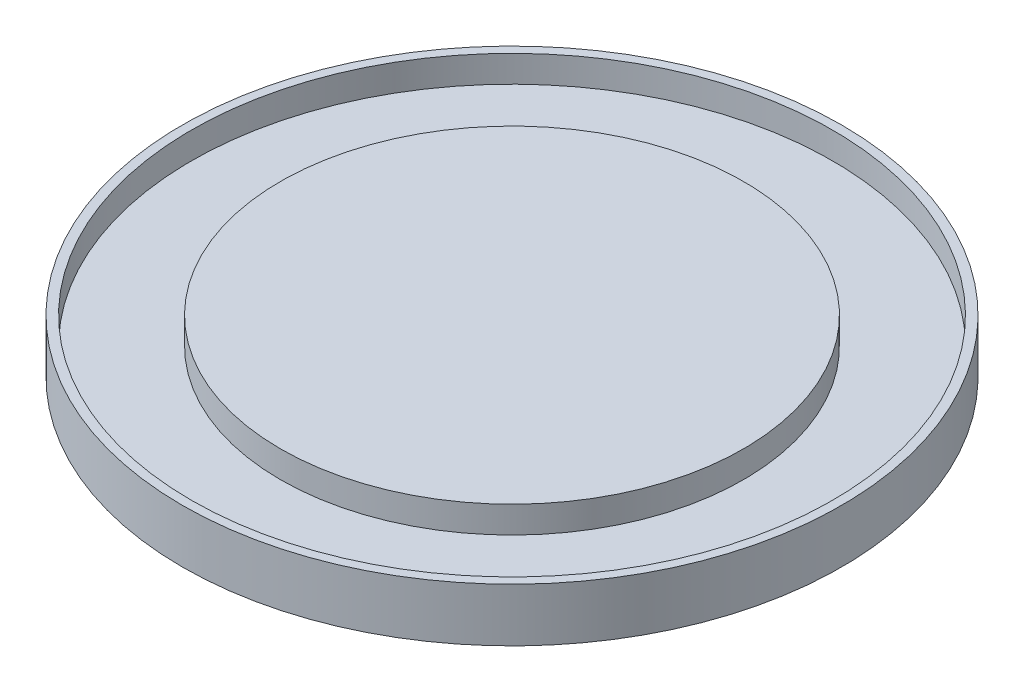
ISO-10303-21;
HEADER;
FILE_DESCRIPTION(('STEP AP214'),'2;1');
FILE_NAME('part.step','',(''),(''),'','','');
FILE_SCHEMA(('AUTOMOTIVE_DESIGN { 1 0 10303 214 1 1 1 1 }'));
ENDSEC;
DATA;
#1=APPLICATION_CONTEXT('core data for automotive mechanical design processes');
#2=APPLICATION_PROTOCOL_DEFINITION('international standard','automotive_design',2000,#1);
#3=PRODUCT_CONTEXT('',#1,'mechanical');
#4=PRODUCT('Part','Part','',(#3));
#5=PRODUCT_RELATED_PRODUCT_CATEGORY('part','',(#4));
#6=PRODUCT_DEFINITION_FORMATION('','',#4);
#7=PRODUCT_DEFINITION_CONTEXT('part definition',#1,'design');
#8=PRODUCT_DEFINITION('design','',#6,#7);
#9=PRODUCT_DEFINITION_SHAPE('','',#8);
#10=(LENGTH_UNIT() NAMED_UNIT(*) SI_UNIT(.MILLI.,.METRE.));
#11=(NAMED_UNIT(*) PLANE_ANGLE_UNIT() SI_UNIT($,.RADIAN.));
#12=(NAMED_UNIT(*) SI_UNIT($,.STERADIAN.) SOLID_ANGLE_UNIT());
#13=UNCERTAINTY_MEASURE_WITH_UNIT(LENGTH_MEASURE(1.E-05),#10,'distance_accuracy_value','');
#14=(GEOMETRIC_REPRESENTATION_CONTEXT(3) GLOBAL_UNCERTAINTY_ASSIGNED_CONTEXT((#13)) GLOBAL_UNIT_ASSIGNED_CONTEXT((#10,
#11,#12)) REPRESENTATION_CONTEXT('',''));
#15=CARTESIAN_POINT('',(0.,0.,0.));
#16=DIRECTION('',(0.,0.,1.));
#17=DIRECTION('',(1.,0.,0.));
#18=AXIS2_PLACEMENT_3D('',#15,#16,#17);
#19=CARTESIAN_POINT('',(0.,2.65609065155807,0.));
#20=DIRECTION('',(0.,-1.,0.));
#21=DIRECTION('',(0.,0.,-1.));
#22=AXIS2_PLACEMENT_3D('',#19,#20,#21);
#23=CYLINDRICAL_SURFACE('',#22,14.8);
#24=CARTESIAN_POINT('',(0.,2.65609065155807,0.));
#25=DIRECTION('',(0.,1.,0.));
#26=DIRECTION('',(0.,0.,1.));
#27=AXIS2_PLACEMENT_3D('',#24,#25,#26);
#28=CIRCLE('',#27,14.8);
#29=CARTESIAN_POINT('',(0.,2.65609065155807,14.8));
#30=VERTEX_POINT('',#29);
#31=EDGE_CURVE('E11',#30,#30,#28,.T.);
#32=ORIENTED_EDGE('',*,*,#31,.F.);
#33=EDGE_LOOP('',(#32));
#34=FACE_BOUND('',#33,.T.);
#35=CARTESIAN_POINT('',(0.,0.256090651558074,0.));
#36=DIRECTION('',(0.,1.,0.));
#37=DIRECTION('',(0.,0.,1.));
#38=AXIS2_PLACEMENT_3D('',#35,#36,#37);
#39=CIRCLE('',#38,14.8);
#40=CARTESIAN_POINT('',(0.,0.256090651558074,14.8));
#41=VERTEX_POINT('',#40);
#42=EDGE_CURVE('E47',#41,#41,#39,.T.);
#43=ORIENTED_EDGE('',*,*,#42,.T.);
#44=EDGE_LOOP('',(#43));
#45=FACE_BOUND('',#44,.T.);
#46=ADVANCED_FACE('F44',(#34,#45),#23,.T.);
#47=CARTESIAN_POINT('',(0.,2.65609065155807,0.));
#48=DIRECTION('',(0.,1.,0.));
#49=DIRECTION('',(0.,0.,1.));
#50=AXIS2_PLACEMENT_3D('',#47,#48,#49);
#51=PLANE('',#50);
#52=CARTESIAN_POINT('',(0.,2.65609065155807,0.));
#53=DIRECTION('',(0.,1.,0.));
#54=DIRECTION('',(0.,0.,1.));
#55=AXIS2_PLACEMENT_3D('',#52,#53,#54);
#56=CIRCLE('',#55,14.4);
#57=CARTESIAN_POINT('',(0.,2.65609065155807,14.4));
#58=VERTEX_POINT('',#57);
#59=EDGE_CURVE('E58',#58,#58,#56,.T.);
#60=ORIENTED_EDGE('',*,*,#59,.F.);
#61=EDGE_LOOP('',(#60));
#62=FACE_BOUND('',#61,.T.);
#63=ORIENTED_EDGE('',*,*,#31,.T.);
#64=EDGE_LOOP('',(#63));
#65=FACE_BOUND('',#64,.T.);
#66=ADVANCED_FACE('F90',(#62,#65),#51,.T.);
#67=CARTESIAN_POINT('',(0.,0.256090651558074,0.));
#68=DIRECTION('',(0.,1.,0.));
#69=DIRECTION('',(0.,0.,1.));
#70=AXIS2_PLACEMENT_3D('',#67,#68,#69);
#71=PLANE('',#70);
#72=ORIENTED_EDGE('',*,*,#42,.F.);
#73=EDGE_LOOP('',(#72));
#74=FACE_BOUND('',#73,.T.);
#75=ADVANCED_FACE('F86',(#74),#71,.F.);
#76=CARTESIAN_POINT('',(0.,1.45609065155807,0.));
#77=DIRECTION('',(0.,1.,0.));
#78=DIRECTION('',(0.,0.,1.));
#79=AXIS2_PLACEMENT_3D('',#76,#77,#78);
#80=CYLINDRICAL_SURFACE('',#79,14.4);
#81=CARTESIAN_POINT('',(0.,1.45609065155807,0.));
#82=DIRECTION('',(0.,1.,0.));
#83=DIRECTION('',(0.,0.,1.));
#84=AXIS2_PLACEMENT_3D('',#81,#82,#83);
#85=CIRCLE('',#84,14.4);
#86=CARTESIAN_POINT('',(0.,1.45609065155807,14.4));
#87=VERTEX_POINT('',#86);
#88=EDGE_CURVE('E56',#87,#87,#85,.T.);
#89=ORIENTED_EDGE('',*,*,#88,.F.);
#90=EDGE_LOOP('',(#89));
#91=FACE_BOUND('',#90,.T.);
#92=ORIENTED_EDGE('',*,*,#59,.T.);
#93=EDGE_LOOP('',(#92));
#94=FACE_BOUND('',#93,.T.);
#95=ADVANCED_FACE('F80',(#91,#94),#80,.F.);
#96=CARTESIAN_POINT('',(0.,1.45609065155807,0.));
#97=DIRECTION('',(0.,1.,0.));
#98=DIRECTION('',(0.,0.,1.));
#99=AXIS2_PLACEMENT_3D('',#96,#97,#98);
#100=PLANE('',#99);
#101=CARTESIAN_POINT('',(0.,1.45609065155807,0.));
#102=DIRECTION('',(0.,1.,0.));
#103=DIRECTION('',(0.,0.,1.));
#104=AXIS2_PLACEMENT_3D('',#101,#102,#103);
#105=CIRCLE('',#104,10.4);
#106=CARTESIAN_POINT('',(0.,1.45609065155807,10.4));
#107=VERTEX_POINT('',#106);
#108=EDGE_CURVE('E62',#107,#107,#105,.T.);
#109=ORIENTED_EDGE('',*,*,#108,.F.);
#110=EDGE_LOOP('',(#109));
#111=FACE_BOUND('',#110,.T.);
#112=ORIENTED_EDGE('',*,*,#88,.T.);
#113=EDGE_LOOP('',(#112));
#114=FACE_BOUND('',#113,.T.);
#115=ADVANCED_FACE('F77',(#111,#114),#100,.T.);
#116=CARTESIAN_POINT('',(0.,1.45609065155807,0.));
#117=DIRECTION('',(0.,1.,0.));
#118=DIRECTION('',(0.,0.,1.));
#119=AXIS2_PLACEMENT_3D('',#116,#117,#118);
#120=CYLINDRICAL_SURFACE('',#119,10.4);
#121=ORIENTED_EDGE('',*,*,#108,.T.);
#122=EDGE_LOOP('',(#121));
#123=FACE_BOUND('',#122,.T.);
#124=CARTESIAN_POINT('',(0.,2.65609065155807,0.));
#125=DIRECTION('',(0.,1.,0.));
#126=DIRECTION('',(0.,0.,1.));
#127=AXIS2_PLACEMENT_3D('',#124,#125,#126);
#128=CIRCLE('',#127,10.4);
#129=CARTESIAN_POINT('',(0.,2.65609065155807,10.4));
#130=VERTEX_POINT('',#129);
#131=EDGE_CURVE('E66',#130,#130,#128,.T.);
#132=ORIENTED_EDGE('',*,*,#131,.F.);
#133=EDGE_LOOP('',(#132));
#134=FACE_BOUND('',#133,.T.);
#135=ADVANCED_FACE('F74',(#123,#134),#120,.T.);
#136=ORIENTED_EDGE('',*,*,#131,.T.);
#137=EDGE_LOOP('',(#136));
#138=FACE_BOUND('',#137,.T.);
#139=ADVANCED_FACE('F93',(#138),#51,.T.);
#140=CLOSED_SHELL('',(#46,#66,#75,#95,#115,#135,#139));
#141=MANIFOLD_SOLID_BREP('B2',#140);
#142=ADVANCED_BREP_SHAPE_REPRESENTATION('',(#18,#141),#14);
#143=SHAPE_DEFINITION_REPRESENTATION(#9,#142);
ENDSEC;
END-ISO-10303-21;
